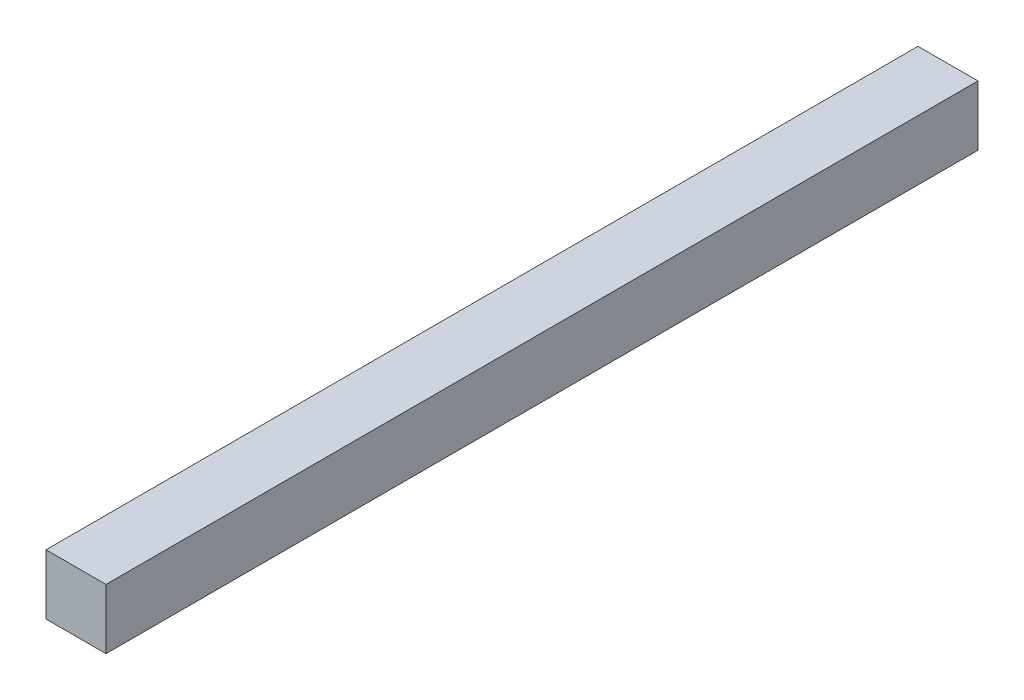
ISO-10303-21;
HEADER;
FILE_DESCRIPTION(('STEP AP214'),'2;1');
FILE_NAME('part.step','',(''),(''),'','','');
FILE_SCHEMA(('AUTOMOTIVE_DESIGN { 1 0 10303 214 1 1 1 1 }'));
ENDSEC;
DATA;
#1=APPLICATION_CONTEXT('core data for automotive mechanical design processes');
#2=APPLICATION_PROTOCOL_DEFINITION('international standard','automotive_design',2000,#1);
#3=PRODUCT_CONTEXT('',#1,'mechanical');
#4=PRODUCT('Part','Part','',(#3));
#5=PRODUCT_RELATED_PRODUCT_CATEGORY('part','',(#4));
#6=PRODUCT_DEFINITION_FORMATION('','',#4);
#7=PRODUCT_DEFINITION_CONTEXT('part definition',#1,'design');
#8=PRODUCT_DEFINITION('design','',#6,#7);
#9=PRODUCT_DEFINITION_SHAPE('','',#8);
#10=(LENGTH_UNIT() NAMED_UNIT(*) SI_UNIT(.MILLI.,.METRE.));
#11=(NAMED_UNIT(*) PLANE_ANGLE_UNIT() SI_UNIT($,.RADIAN.));
#12=(NAMED_UNIT(*) SI_UNIT($,.STERADIAN.) SOLID_ANGLE_UNIT());
#13=UNCERTAINTY_MEASURE_WITH_UNIT(LENGTH_MEASURE(1.E-05),#10,'distance_accuracy_value','');
#14=(GEOMETRIC_REPRESENTATION_CONTEXT(3) GLOBAL_UNCERTAINTY_ASSIGNED_CONTEXT((#13)) GLOBAL_UNIT_ASSIGNED_CONTEXT((#10,
#11,#12)) REPRESENTATION_CONTEXT('',''));
#15=CARTESIAN_POINT('',(0.,0.,0.));
#16=DIRECTION('',(0.,0.,1.));
#17=DIRECTION('',(1.,0.,0.));
#18=AXIS2_PLACEMENT_3D('',#15,#16,#17);
#19=CARTESIAN_POINT('',(-19.5762350936968,22.7172061328773,436.));
#20=DIRECTION('',(1.,0.,0.));
#21=DIRECTION('',(0.,1.,0.));
#22=AXIS2_PLACEMENT_3D('',#19,#20,#21);
#23=PLANE('',#22);
#24=DIRECTION('',(0.,-1.,0.));
#25=VECTOR('',#24,1.);
#26=CARTESIAN_POINT('',(-19.5762350936968,22.7172061328773,0.));
#27=LINE('',#26,#25);
#28=CARTESIAN_POINT('',(-19.5762350936968,22.7172061328773,0.));
#29=VERTEX_POINT('',#28);
#30=CARTESIAN_POINT('',(-19.5762350936968,-7.2827938671227,0.));
#31=VERTEX_POINT('',#30);
#32=EDGE_CURVE('E95',#29,#31,#27,.T.);
#33=ORIENTED_EDGE('',*,*,#32,.T.);
#34=DIRECTION('',(0.,0.,-1.));
#35=VECTOR('',#34,1.);
#36=CARTESIAN_POINT('',(-19.5762350936968,-7.2827938671227,436.));
#37=LINE('',#36,#35);
#38=CARTESIAN_POINT('',(-19.5762350936968,-7.2827938671227,436.));
#39=VERTEX_POINT('',#38);
#40=EDGE_CURVE('E11',#39,#31,#37,.T.);
#41=ORIENTED_EDGE('',*,*,#40,.F.);
#42=DIRECTION('',(0.,-1.,0.));
#43=VECTOR('',#42,1.);
#44=CARTESIAN_POINT('',(-19.5762350936968,22.7172061328773,436.));
#45=LINE('',#44,#43);
#46=CARTESIAN_POINT('',(-19.5762350936968,22.7172061328773,436.));
#47=VERTEX_POINT('',#46);
#48=EDGE_CURVE('E83',#47,#39,#45,.T.);
#49=ORIENTED_EDGE('',*,*,#48,.F.);
#50=DIRECTION('',(0.,0.,-1.));
#51=VECTOR('',#50,1.);
#52=CARTESIAN_POINT('',(-19.5762350936968,22.7172061328773,436.));
#53=LINE('',#52,#51);
#54=EDGE_CURVE('E91',#47,#29,#53,.T.);
#55=ORIENTED_EDGE('',*,*,#54,.T.);
#56=EDGE_LOOP('',(#33,#41,#49,#55));
#57=FACE_BOUND('',#56,.T.);
#58=ADVANCED_FACE('F32',(#57),#23,.F.);
#59=CARTESIAN_POINT('',(-19.5762350936968,-7.2827938671227,436.));
#60=DIRECTION('',(0.,1.,0.));
#61=DIRECTION('',(0.,0.,1.));
#62=AXIS2_PLACEMENT_3D('',#59,#60,#61);
#63=PLANE('',#62);
#64=DIRECTION('',(1.,0.,0.));
#65=VECTOR('',#64,1.);
#66=CARTESIAN_POINT('',(-19.5762350936968,-7.2827938671227,0.));
#67=LINE('',#66,#65);
#68=CARTESIAN_POINT('',(10.4237649063032,-7.2827938671227,0.));
#69=VERTEX_POINT('',#68);
#70=EDGE_CURVE('E87',#31,#69,#67,.T.);
#71=ORIENTED_EDGE('',*,*,#70,.T.);
#72=DIRECTION('',(0.,0.,-1.));
#73=VECTOR('',#72,1.);
#74=CARTESIAN_POINT('',(10.4237649063032,-7.2827938671227,436.));
#75=LINE('',#74,#73);
#76=CARTESIAN_POINT('',(10.4237649063032,-7.2827938671227,436.));
#77=VERTEX_POINT('',#76);
#78=EDGE_CURVE('E40',#77,#69,#75,.T.);
#79=ORIENTED_EDGE('',*,*,#78,.F.);
#80=DIRECTION('',(1.,0.,0.));
#81=VECTOR('',#80,1.);
#82=CARTESIAN_POINT('',(-19.5762350936968,-7.2827938671227,436.));
#83=LINE('',#82,#81);
#84=EDGE_CURVE('E78',#39,#77,#83,.T.);
#85=ORIENTED_EDGE('',*,*,#84,.F.);
#86=ORIENTED_EDGE('',*,*,#40,.T.);
#87=EDGE_LOOP('',(#71,#79,#85,#86));
#88=FACE_BOUND('',#87,.T.);
#89=ADVANCED_FACE('F86',(#88),#63,.F.);
#90=CARTESIAN_POINT('',(10.4237649063032,22.7172061328773,436.));
#91=DIRECTION('',(-1.,0.,0.));
#92=DIRECTION('',(0.,-1.,0.));
#93=AXIS2_PLACEMENT_3D('',#90,#91,#92);
#94=PLANE('',#93);
#95=DIRECTION('',(0.,1.,0.));
#96=VECTOR('',#95,1.);
#97=CARTESIAN_POINT('',(10.4237649063032,22.7172061328773,0.));
#98=LINE('',#97,#96);
#99=CARTESIAN_POINT('',(10.4237649063032,22.7172061328773,0.));
#100=VERTEX_POINT('',#99);
#101=EDGE_CURVE('E65',#69,#100,#98,.T.);
#102=ORIENTED_EDGE('',*,*,#101,.T.);
#103=DIRECTION('',(0.,0.,-1.));
#104=VECTOR('',#103,1.);
#105=CARTESIAN_POINT('',(10.4237649063032,22.7172061328773,436.));
#106=LINE('',#105,#104);
#107=CARTESIAN_POINT('',(10.4237649063032,22.7172061328773,436.));
#108=VERTEX_POINT('',#107);
#109=EDGE_CURVE('E88',#108,#100,#106,.T.);
#110=ORIENTED_EDGE('',*,*,#109,.F.);
#111=DIRECTION('',(0.,1.,0.));
#112=VECTOR('',#111,1.);
#113=CARTESIAN_POINT('',(10.4237649063032,22.7172061328773,436.));
#114=LINE('',#113,#112);
#115=EDGE_CURVE('E81',#77,#108,#114,.T.);
#116=ORIENTED_EDGE('',*,*,#115,.F.);
#117=ORIENTED_EDGE('',*,*,#78,.T.);
#118=EDGE_LOOP('',(#102,#110,#116,#117));
#119=FACE_BOUND('',#118,.T.);
#120=ADVANCED_FACE('F89',(#119),#94,.F.);
#121=CARTESIAN_POINT('',(-19.5762350936968,22.7172061328773,436.));
#122=DIRECTION('',(0.,-1.,0.));
#123=DIRECTION('',(0.,0.,-1.));
#124=AXIS2_PLACEMENT_3D('',#121,#122,#123);
#125=PLANE('',#124);
#126=DIRECTION('',(-1.,0.,0.));
#127=VECTOR('',#126,1.);
#128=CARTESIAN_POINT('',(-19.5762350936968,22.7172061328773,0.));
#129=LINE('',#128,#127);
#130=EDGE_CURVE('E71',#100,#29,#129,.T.);
#131=ORIENTED_EDGE('',*,*,#130,.T.);
#132=ORIENTED_EDGE('',*,*,#54,.F.);
#133=DIRECTION('',(-1.,0.,0.));
#134=VECTOR('',#133,1.);
#135=CARTESIAN_POINT('',(-19.5762350936968,22.7172061328773,436.));
#136=LINE('',#135,#134);
#137=EDGE_CURVE('E48',#108,#47,#136,.T.);
#138=ORIENTED_EDGE('',*,*,#137,.F.);
#139=ORIENTED_EDGE('',*,*,#109,.T.);
#140=EDGE_LOOP('',(#131,#132,#138,#139));
#141=FACE_BOUND('',#140,.T.);
#142=ADVANCED_FACE('F102',(#141),#125,.F.);
#143=CARTESIAN_POINT('',(0.,0.,436.));
#144=DIRECTION('',(0.,0.,1.));
#145=DIRECTION('',(1.,0.,0.));
#146=AXIS2_PLACEMENT_3D('',#143,#144,#145);
#147=PLANE('',#146);
#148=ORIENTED_EDGE('',*,*,#48,.T.);
#149=ORIENTED_EDGE('',*,*,#84,.T.);
#150=ORIENTED_EDGE('',*,*,#115,.T.);
#151=ORIENTED_EDGE('',*,*,#137,.T.);
#152=EDGE_LOOP('',(#148,#149,#150,#151));
#153=FACE_BOUND('',#152,.T.);
#154=ADVANCED_FACE('F79',(#153),#147,.T.);
#155=CARTESIAN_POINT('',(0.,0.,0.));
#156=DIRECTION('',(0.,0.,1.));
#157=DIRECTION('',(1.,0.,0.));
#158=AXIS2_PLACEMENT_3D('',#155,#156,#157);
#159=PLANE('',#158);
#160=ORIENTED_EDGE('',*,*,#32,.F.);
#161=ORIENTED_EDGE('',*,*,#130,.F.);
#162=ORIENTED_EDGE('',*,*,#101,.F.);
#163=ORIENTED_EDGE('',*,*,#70,.F.);
#164=EDGE_LOOP('',(#160,#161,#162,#163));
#165=FACE_BOUND('',#164,.T.);
#166=ADVANCED_FACE('F105',(#165),#159,.F.);
#167=CLOSED_SHELL('',(#58,#89,#120,#142,#154,#166));
#168=MANIFOLD_SOLID_BREP('B2',#167);
#169=ADVANCED_BREP_SHAPE_REPRESENTATION('',(#18,#168),#14);
#170=SHAPE_DEFINITION_REPRESENTATION(#9,#169);
ENDSEC;
END-ISO-10303-21;
